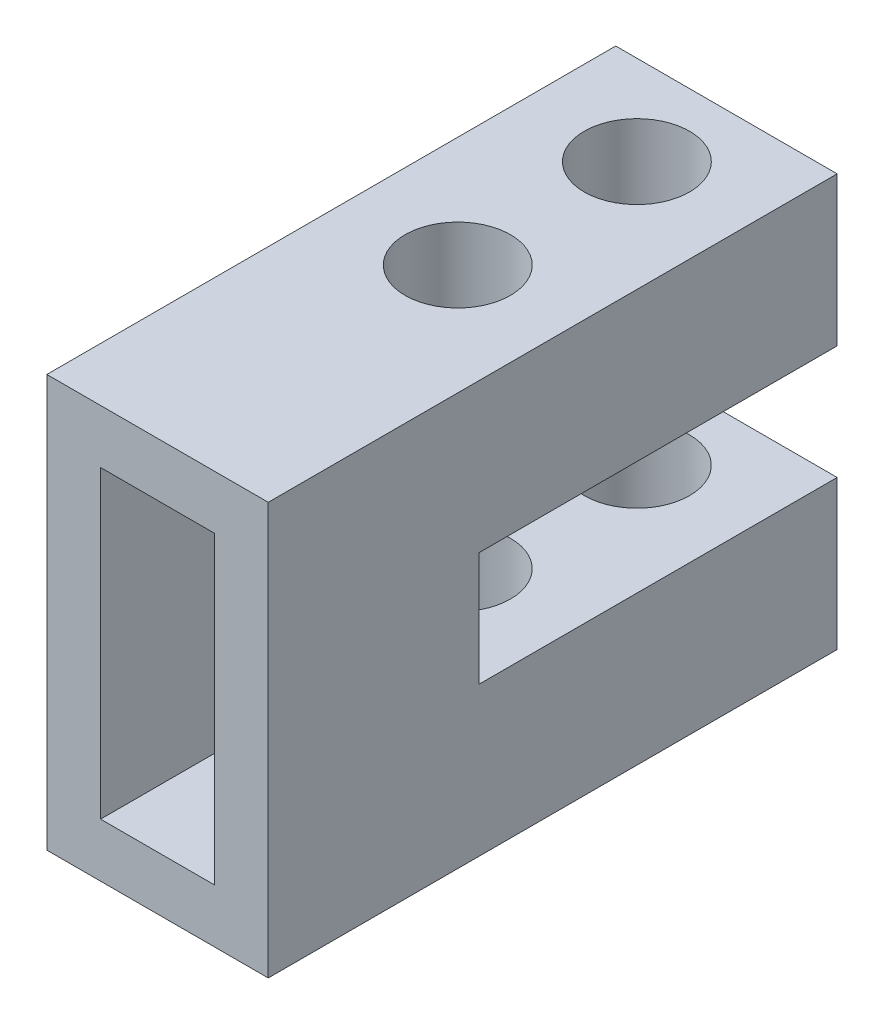
ISO-10303-21;
HEADER;
FILE_DESCRIPTION(('STEP AP214'),'2;1');
FILE_NAME('part.step','',(''),(''),'','','');
FILE_SCHEMA(('AUTOMOTIVE_DESIGN { 1 0 10303 214 1 1 1 1 }'));
ENDSEC;
DATA;
#1=APPLICATION_CONTEXT('core data for automotive mechanical design processes');
#2=APPLICATION_PROTOCOL_DEFINITION('international standard','automotive_design',2000,#1);
#3=PRODUCT_CONTEXT('',#1,'mechanical');
#4=PRODUCT('Part','Part','',(#3));
#5=PRODUCT_RELATED_PRODUCT_CATEGORY('part','',(#4));
#6=PRODUCT_DEFINITION_FORMATION('','',#4);
#7=PRODUCT_DEFINITION_CONTEXT('part definition',#1,'design');
#8=PRODUCT_DEFINITION('design','',#6,#7);
#9=PRODUCT_DEFINITION_SHAPE('','',#8);
#10=(LENGTH_UNIT() NAMED_UNIT(*) SI_UNIT(.MILLI.,.METRE.));
#11=(NAMED_UNIT(*) PLANE_ANGLE_UNIT() SI_UNIT($,.RADIAN.));
#12=(NAMED_UNIT(*) SI_UNIT($,.STERADIAN.) SOLID_ANGLE_UNIT());
#13=UNCERTAINTY_MEASURE_WITH_UNIT(LENGTH_MEASURE(1.E-05),#10,'distance_accuracy_value','');
#14=(GEOMETRIC_REPRESENTATION_CONTEXT(3) GLOBAL_UNCERTAINTY_ASSIGNED_CONTEXT((#13)) GLOBAL_UNIT_ASSIGNED_CONTEXT((#10,
#11,#12)) REPRESENTATION_CONTEXT('',''));
#15=CARTESIAN_POINT('',(0.,0.,0.));
#16=DIRECTION('',(0.,0.,1.));
#17=DIRECTION('',(1.,0.,0.));
#18=AXIS2_PLACEMENT_3D('',#15,#16,#17);
#19=CARTESIAN_POINT('',(0.,0.,-1.));
#20=DIRECTION('',(0.,0.,-1.));
#21=DIRECTION('',(-1.,0.,0.));
#22=AXIS2_PLACEMENT_3D('',#19,#20,#21);
#23=PLANE('',#22);
#24=DIRECTION('',(0.,-1.,0.));
#25=VECTOR('',#24,1.);
#26=CARTESIAN_POINT('',(4.68,10.,-1.));
#27=LINE('',#26,#25);
#28=CARTESIAN_POINT('',(4.68,5.84,-1.));
#29=VERTEX_POINT('',#28);
#30=CARTESIAN_POINT('',(4.68,2.66,-1.));
#31=VERTEX_POINT('',#30);
#32=EDGE_CURVE('E177',#29,#31,#27,.T.);
#33=ORIENTED_EDGE('',*,*,#32,.T.);
#34=DIRECTION('',(1.,0.,0.));
#35=VECTOR('',#34,1.);
#36=CARTESIAN_POINT('',(4.68,2.66,-1.));
#37=LINE('',#36,#35);
#38=CARTESIAN_POINT('',(-1.5,2.66,-1.));
#39=VERTEX_POINT('',#38);
#40=EDGE_CURVE('E147',#39,#31,#37,.T.);
#41=ORIENTED_EDGE('',*,*,#40,.F.);
#42=DIRECTION('',(0.,1.,0.));
#43=VECTOR('',#42,1.);
#44=CARTESIAN_POINT('',(-1.5,10.,-1.));
#45=LINE('',#44,#43);
#46=CARTESIAN_POINT('',(-1.5,5.84,-1.));
#47=VERTEX_POINT('',#46);
#48=EDGE_CURVE('E179',#39,#47,#45,.T.);
#49=ORIENTED_EDGE('',*,*,#48,.T.);
#50=DIRECTION('',(-1.,0.,0.));
#51=VECTOR('',#50,1.);
#52=CARTESIAN_POINT('',(4.68,5.84,-1.));
#53=LINE('',#52,#51);
#54=EDGE_CURVE('E58',#29,#47,#53,.T.);
#55=ORIENTED_EDGE('',*,*,#54,.F.);
#56=EDGE_LOOP('',(#33,#41,#49,#55));
#57=FACE_BOUND('',#56,.T.);
#58=ADVANCED_FACE('F33',(#57),#23,.T.);
#59=CARTESIAN_POINT('',(0.,0.,4.88));
#60=DIRECTION('',(0.,0.,1.));
#61=DIRECTION('',(1.,0.,0.));
#62=AXIS2_PLACEMENT_3D('',#59,#60,#61);
#63=PLANE('',#62);
#64=DIRECTION('',(0.,-1.,0.));
#65=VECTOR('',#64,1.);
#66=CARTESIAN_POINT('',(-1.5,10.,4.88));
#67=LINE('',#66,#65);
#68=CARTESIAN_POINT('',(-1.5,10.,4.88));
#69=VERTEX_POINT('',#68);
#70=CARTESIAN_POINT('',(-1.5,-1.5,4.88));
#71=VERTEX_POINT('',#70);
#72=EDGE_CURVE('E211',#69,#71,#67,.T.);
#73=ORIENTED_EDGE('',*,*,#72,.T.);
#74=DIRECTION('',(1.,0.,0.));
#75=VECTOR('',#74,1.);
#76=CARTESIAN_POINT('',(-1.5,-1.5,4.88));
#77=LINE('',#76,#75);
#78=CARTESIAN_POINT('',(4.68,-1.5,4.88));
#79=VERTEX_POINT('',#78);
#80=EDGE_CURVE('E214',#71,#79,#77,.T.);
#81=ORIENTED_EDGE('',*,*,#80,.T.);
#82=DIRECTION('',(0.,1.,0.));
#83=VECTOR('',#82,1.);
#84=CARTESIAN_POINT('',(4.68,10.,4.88));
#85=LINE('',#84,#83);
#86=CARTESIAN_POINT('',(4.68,10.,4.88));
#87=VERTEX_POINT('',#86);
#88=EDGE_CURVE('E132',#79,#87,#85,.T.);
#89=ORIENTED_EDGE('',*,*,#88,.T.);
#90=DIRECTION('',(-1.,0.,0.));
#91=VECTOR('',#90,1.);
#92=CARTESIAN_POINT('',(-1.5,10.,4.88));
#93=LINE('',#92,#91);
#94=EDGE_CURVE('E217',#87,#69,#93,.T.);
#95=ORIENTED_EDGE('',*,*,#94,.T.);
#96=EDGE_LOOP('',(#73,#81,#89,#95));
#97=FACE_BOUND('',#96,.T.);
#98=DIRECTION('',(1.,0.,0.));
#99=VECTOR('',#98,1.);
#100=CARTESIAN_POINT('',(0.,0.,4.88));
#101=LINE('',#100,#99);
#102=CARTESIAN_POINT('',(0.,0.,4.88));
#103=VERTEX_POINT('',#102);
#104=CARTESIAN_POINT('',(3.18,0.,4.88));
#105=VERTEX_POINT('',#104);
#106=EDGE_CURVE('E184',#103,#105,#101,.T.);
#107=ORIENTED_EDGE('',*,*,#106,.F.);
#108=DIRECTION('',(0.,-1.,0.));
#109=VECTOR('',#108,1.);
#110=CARTESIAN_POINT('',(0.,0.,4.88));
#111=LINE('',#110,#109);
#112=CARTESIAN_POINT('',(0.,8.5,4.88));
#113=VERTEX_POINT('',#112);
#114=EDGE_CURVE('E182',#113,#103,#111,.T.);
#115=ORIENTED_EDGE('',*,*,#114,.F.);
#116=DIRECTION('',(-1.,0.,0.));
#117=VECTOR('',#116,1.);
#118=CARTESIAN_POINT('',(0.,8.5,4.88));
#119=LINE('',#118,#117);
#120=CARTESIAN_POINT('',(3.18,8.5,4.88));
#121=VERTEX_POINT('',#120);
#122=EDGE_CURVE('E190',#121,#113,#119,.T.);
#123=ORIENTED_EDGE('',*,*,#122,.F.);
#124=DIRECTION('',(0.,1.,0.));
#125=VECTOR('',#124,1.);
#126=CARTESIAN_POINT('',(3.18,0.,4.88));
#127=LINE('',#126,#125);
#128=EDGE_CURVE('E187',#105,#121,#127,.T.);
#129=ORIENTED_EDGE('',*,*,#128,.F.);
#130=EDGE_LOOP('',(#107,#115,#123,#129));
#131=FACE_BOUND('',#130,.T.);
#132=ADVANCED_FACE('F267',(#97,#131),#63,.T.);
#133=CARTESIAN_POINT('',(-1.5,10.,4.88));
#134=DIRECTION('',(1.,0.,0.));
#135=DIRECTION('',(0.,1.,0.));
#136=AXIS2_PLACEMENT_3D('',#133,#134,#135);
#137=PLANE('',#136);
#138=DIRECTION('',(0.,0.,-1.));
#139=VECTOR('',#138,1.);
#140=CARTESIAN_POINT('',(-1.5,10.,4.88));
#141=LINE('',#140,#139);
#142=CARTESIAN_POINT('',(-1.5,10.,-11.));
#143=VERTEX_POINT('',#142);
#144=EDGE_CURVE('E219',#69,#143,#141,.T.);
#145=ORIENTED_EDGE('',*,*,#144,.T.);
#146=DIRECTION('',(0.,1.,0.));
#147=VECTOR('',#146,1.);
#148=CARTESIAN_POINT('',(-1.5,10.,-11.));
#149=LINE('',#148,#147);
#150=CARTESIAN_POINT('',(-1.5,5.84,-11.));
#151=VERTEX_POINT('',#150);
#152=EDGE_CURVE('E164',#151,#143,#149,.T.);
#153=ORIENTED_EDGE('',*,*,#152,.F.);
#154=DIRECTION('',(0.,0.,1.));
#155=VECTOR('',#154,1.);
#156=CARTESIAN_POINT('',(-1.5,5.84,-11.));
#157=LINE('',#156,#155);
#158=EDGE_CURVE('E170',#151,#47,#157,.T.);
#159=ORIENTED_EDGE('',*,*,#158,.T.);
#160=ORIENTED_EDGE('',*,*,#48,.F.);
#161=DIRECTION('',(0.,0.,1.));
#162=VECTOR('',#161,1.);
#163=CARTESIAN_POINT('',(-1.5,2.66,-11.));
#164=LINE('',#163,#162);
#165=CARTESIAN_POINT('',(-1.5,2.66,-11.));
#166=VERTEX_POINT('',#165);
#167=EDGE_CURVE('E50',#166,#39,#164,.T.);
#168=ORIENTED_EDGE('',*,*,#167,.F.);
#169=DIRECTION('',(0.,1.,0.));
#170=VECTOR('',#169,1.);
#171=CARTESIAN_POINT('',(-1.5,-1.5,-11.));
#172=LINE('',#171,#170);
#173=CARTESIAN_POINT('',(-1.5,-1.5,-11.));
#174=VERTEX_POINT('',#173);
#175=EDGE_CURVE('E142',#174,#166,#172,.T.);
#176=ORIENTED_EDGE('',*,*,#175,.F.);
#177=DIRECTION('',(0.,0.,-1.));
#178=VECTOR('',#177,1.);
#179=CARTESIAN_POINT('',(-1.5,-1.5,4.88));
#180=LINE('',#179,#178);
#181=EDGE_CURVE('E11',#71,#174,#180,.T.);
#182=ORIENTED_EDGE('',*,*,#181,.F.);
#183=ORIENTED_EDGE('',*,*,#72,.F.);
#184=EDGE_LOOP('',(#145,#153,#159,#160,#168,#176,#182,#183));
#185=FACE_BOUND('',#184,.T.);
#186=ADVANCED_FACE('F35',(#185),#137,.F.);
#187=CARTESIAN_POINT('',(-1.5,-1.5,4.88));
#188=DIRECTION('',(0.,1.,0.));
#189=DIRECTION('',(0.,0.,1.));
#190=AXIS2_PLACEMENT_3D('',#187,#188,#189);
#191=PLANE('',#190);
#192=CARTESIAN_POINT('',(1.59,-1.5,-3.50000000000008));
#193=DIRECTION('',(0.,1.,0.));
#194=DIRECTION('',(0.,0.,1.));
#195=AXIS2_PLACEMENT_3D('',#192,#193,#194);
#196=CIRCLE('',#195,1.47);
#197=CARTESIAN_POINT('',(1.59,-1.5,-2.03000000000008));
#198=VERTEX_POINT('',#197);
#199=EDGE_CURVE('E224',#198,#198,#196,.T.);
#200=ORIENTED_EDGE('',*,*,#199,.T.);
#201=EDGE_LOOP('',(#200));
#202=FACE_BOUND('',#201,.T.);
#203=CARTESIAN_POINT('',(1.59,-1.5,-8.5));
#204=DIRECTION('',(0.,1.,0.));
#205=DIRECTION('',(0.,0.,1.));
#206=AXIS2_PLACEMENT_3D('',#203,#204,#205);
#207=CIRCLE('',#206,1.47);
#208=CARTESIAN_POINT('',(1.59,-1.5,-7.03));
#209=VERTEX_POINT('',#208);
#210=EDGE_CURVE('E234',#209,#209,#207,.T.);
#211=ORIENTED_EDGE('',*,*,#210,.T.);
#212=EDGE_LOOP('',(#211));
#213=FACE_BOUND('',#212,.T.);
#214=ORIENTED_EDGE('',*,*,#181,.T.);
#215=DIRECTION('',(-1.,0.,0.));
#216=VECTOR('',#215,1.);
#217=CARTESIAN_POINT('',(4.68,-1.5,-11.));
#218=LINE('',#217,#216);
#219=CARTESIAN_POINT('',(4.68,-1.5,-11.));
#220=VERTEX_POINT('',#219);
#221=EDGE_CURVE('E137',#220,#174,#218,.T.);
#222=ORIENTED_EDGE('',*,*,#221,.F.);
#223=DIRECTION('',(0.,0.,-1.));
#224=VECTOR('',#223,1.);
#225=CARTESIAN_POINT('',(4.68,-1.5,4.88));
#226=LINE('',#225,#224);
#227=EDGE_CURVE('E42',#79,#220,#226,.T.);
#228=ORIENTED_EDGE('',*,*,#227,.F.);
#229=ORIENTED_EDGE('',*,*,#80,.F.);
#230=EDGE_LOOP('',(#214,#222,#228,#229));
#231=FACE_BOUND('',#230,.T.);
#232=ADVANCED_FACE('F138',(#202,#213,#231),#191,.F.);
#233=CARTESIAN_POINT('',(4.68,10.,4.88));
#234=DIRECTION('',(-1.,0.,0.));
#235=DIRECTION('',(0.,-1.,0.));
#236=AXIS2_PLACEMENT_3D('',#233,#234,#235);
#237=PLANE('',#236);
#238=ORIENTED_EDGE('',*,*,#227,.T.);
#239=DIRECTION('',(0.,-1.,0.));
#240=VECTOR('',#239,1.);
#241=CARTESIAN_POINT('',(4.68,-1.5,-11.));
#242=LINE('',#241,#240);
#243=CARTESIAN_POINT('',(4.68,2.66,-11.));
#244=VERTEX_POINT('',#243);
#245=EDGE_CURVE('E130',#244,#220,#242,.T.);
#246=ORIENTED_EDGE('',*,*,#245,.F.);
#247=DIRECTION('',(0.,0.,1.));
#248=VECTOR('',#247,1.);
#249=CARTESIAN_POINT('',(4.68,2.66,-11.));
#250=LINE('',#249,#248);
#251=EDGE_CURVE('E155',#244,#31,#250,.T.);
#252=ORIENTED_EDGE('',*,*,#251,.T.);
#253=ORIENTED_EDGE('',*,*,#32,.F.);
#254=DIRECTION('',(0.,0.,1.));
#255=VECTOR('',#254,1.);
#256=CARTESIAN_POINT('',(4.68,5.84,-11.));
#257=LINE('',#256,#255);
#258=CARTESIAN_POINT('',(4.68,5.84,-11.));
#259=VERTEX_POINT('',#258);
#260=EDGE_CURVE('E174',#259,#29,#257,.T.);
#261=ORIENTED_EDGE('',*,*,#260,.F.);
#262=DIRECTION('',(0.,-1.,0.));
#263=VECTOR('',#262,1.);
#264=CARTESIAN_POINT('',(4.68,10.,-11.));
#265=LINE('',#264,#263);
#266=CARTESIAN_POINT('',(4.68,10.,-11.));
#267=VERTEX_POINT('',#266);
#268=EDGE_CURVE('E159',#267,#259,#265,.T.);
#269=ORIENTED_EDGE('',*,*,#268,.F.);
#270=DIRECTION('',(0.,0.,-1.));
#271=VECTOR('',#270,1.);
#272=CARTESIAN_POINT('',(4.68,10.,4.88));
#273=LINE('',#272,#271);
#274=EDGE_CURVE('E134',#87,#267,#273,.T.);
#275=ORIENTED_EDGE('',*,*,#274,.F.);
#276=ORIENTED_EDGE('',*,*,#88,.F.);
#277=EDGE_LOOP('',(#238,#246,#252,#253,#261,#269,#275,#276));
#278=FACE_BOUND('',#277,.T.);
#279=ADVANCED_FACE('F127',(#278),#237,.F.);
#280=CARTESIAN_POINT('',(-1.5,10.,4.88));
#281=DIRECTION('',(0.,-1.,0.));
#282=DIRECTION('',(0.,0.,-1.));
#283=AXIS2_PLACEMENT_3D('',#280,#281,#282);
#284=PLANE('',#283);
#285=CARTESIAN_POINT('',(1.59,10.,-3.50000000000008));
#286=DIRECTION('',(0.,1.,0.));
#287=DIRECTION('',(0.,0.,1.));
#288=AXIS2_PLACEMENT_3D('',#285,#286,#287);
#289=CIRCLE('',#288,1.47);
#290=CARTESIAN_POINT('',(1.59,10.,-2.03000000000008));
#291=VERTEX_POINT('',#290);
#292=EDGE_CURVE('E229',#291,#291,#289,.T.);
#293=ORIENTED_EDGE('',*,*,#292,.F.);
#294=EDGE_LOOP('',(#293));
#295=FACE_BOUND('',#294,.T.);
#296=CARTESIAN_POINT('',(1.59,10.,-8.5));
#297=DIRECTION('',(0.,1.,0.));
#298=DIRECTION('',(0.,0.,1.));
#299=AXIS2_PLACEMENT_3D('',#296,#297,#298);
#300=CIRCLE('',#299,1.47);
#301=CARTESIAN_POINT('',(1.59,10.,-7.03));
#302=VERTEX_POINT('',#301);
#303=EDGE_CURVE('E239',#302,#302,#300,.T.);
#304=ORIENTED_EDGE('',*,*,#303,.F.);
#305=EDGE_LOOP('',(#304));
#306=FACE_BOUND('',#305,.T.);
#307=ORIENTED_EDGE('',*,*,#274,.T.);
#308=DIRECTION('',(1.,0.,0.));
#309=VECTOR('',#308,1.);
#310=CARTESIAN_POINT('',(4.68,10.,-11.));
#311=LINE('',#310,#309);
#312=EDGE_CURVE('E167',#143,#267,#311,.T.);
#313=ORIENTED_EDGE('',*,*,#312,.F.);
#314=ORIENTED_EDGE('',*,*,#144,.F.);
#315=ORIENTED_EDGE('',*,*,#94,.F.);
#316=EDGE_LOOP('',(#307,#313,#314,#315));
#317=FACE_BOUND('',#316,.T.);
#318=ADVANCED_FACE('F246',(#295,#306,#317),#284,.F.);
#319=CARTESIAN_POINT('',(0.,0.,4.88));
#320=DIRECTION('',(1.,0.,0.));
#321=DIRECTION('',(0.,0.,-1.));
#322=AXIS2_PLACEMENT_3D('',#319,#320,#321);
#323=PLANE('',#322);
#324=DIRECTION('',(0.,-1.,0.));
#325=VECTOR('',#324,1.);
#326=CARTESIAN_POINT('',(0.,0.,0.));
#327=LINE('',#326,#325);
#328=CARTESIAN_POINT('',(0.,8.5,0.));
#329=VERTEX_POINT('',#328);
#330=CARTESIAN_POINT('',(0.,0.,0.));
#331=VERTEX_POINT('',#330);
#332=EDGE_CURVE('E181',#329,#331,#327,.T.);
#333=ORIENTED_EDGE('',*,*,#332,.F.);
#334=DIRECTION('',(0.,0.,-1.));
#335=VECTOR('',#334,1.);
#336=CARTESIAN_POINT('',(0.,8.5,4.88));
#337=LINE('',#336,#335);
#338=EDGE_CURVE('E192',#113,#329,#337,.T.);
#339=ORIENTED_EDGE('',*,*,#338,.F.);
#340=ORIENTED_EDGE('',*,*,#114,.T.);
#341=DIRECTION('',(0.,0.,-1.));
#342=VECTOR('',#341,1.);
#343=CARTESIAN_POINT('',(0.,0.,4.88));
#344=LINE('',#343,#342);
#345=EDGE_CURVE('E208',#103,#331,#344,.T.);
#346=ORIENTED_EDGE('',*,*,#345,.T.);
#347=EDGE_LOOP('',(#333,#339,#340,#346));
#348=FACE_BOUND('',#347,.T.);
#349=ADVANCED_FACE('F249',(#348),#323,.T.);
#350=CARTESIAN_POINT('',(0.,0.,4.88));
#351=DIRECTION('',(0.,1.,0.));
#352=DIRECTION('',(0.,0.,1.));
#353=AXIS2_PLACEMENT_3D('',#350,#351,#352);
#354=PLANE('',#353);
#355=DIRECTION('',(1.,0.,0.));
#356=VECTOR('',#355,1.);
#357=CARTESIAN_POINT('',(0.,0.,0.));
#358=LINE('',#357,#356);
#359=CARTESIAN_POINT('',(3.18,0.,0.));
#360=VERTEX_POINT('',#359);
#361=EDGE_CURVE('E195',#331,#360,#358,.T.);
#362=ORIENTED_EDGE('',*,*,#361,.F.);
#363=ORIENTED_EDGE('',*,*,#345,.F.);
#364=ORIENTED_EDGE('',*,*,#106,.T.);
#365=DIRECTION('',(0.,0.,-1.));
#366=VECTOR('',#365,1.);
#367=CARTESIAN_POINT('',(3.18,0.,4.88));
#368=LINE('',#367,#366);
#369=EDGE_CURVE('E206',#105,#360,#368,.T.);
#370=ORIENTED_EDGE('',*,*,#369,.T.);
#371=EDGE_LOOP('',(#362,#363,#364,#370));
#372=FACE_BOUND('',#371,.T.);
#373=ADVANCED_FACE('F278',(#372),#354,.T.);
#374=CARTESIAN_POINT('',(3.18,0.,4.88));
#375=DIRECTION('',(-1.,0.,0.));
#376=DIRECTION('',(0.,0.,1.));
#377=AXIS2_PLACEMENT_3D('',#374,#375,#376);
#378=PLANE('',#377);
#379=DIRECTION('',(0.,1.,0.));
#380=VECTOR('',#379,1.);
#381=CARTESIAN_POINT('',(3.18,0.,0.));
#382=LINE('',#381,#380);
#383=CARTESIAN_POINT('',(3.18,8.5,0.));
#384=VERTEX_POINT('',#383);
#385=EDGE_CURVE('E198',#360,#384,#382,.T.);
#386=ORIENTED_EDGE('',*,*,#385,.F.);
#387=ORIENTED_EDGE('',*,*,#369,.F.);
#388=ORIENTED_EDGE('',*,*,#128,.T.);
#389=DIRECTION('',(0.,0.,-1.));
#390=VECTOR('',#389,1.);
#391=CARTESIAN_POINT('',(3.18,8.5,4.88));
#392=LINE('',#391,#390);
#393=EDGE_CURVE('E204',#121,#384,#392,.T.);
#394=ORIENTED_EDGE('',*,*,#393,.T.);
#395=EDGE_LOOP('',(#386,#387,#388,#394));
#396=FACE_BOUND('',#395,.T.);
#397=ADVANCED_FACE('F281',(#396),#378,.T.);
#398=CARTESIAN_POINT('',(0.,8.5,4.88));
#399=DIRECTION('',(0.,-1.,0.));
#400=DIRECTION('',(0.,0.,-1.));
#401=AXIS2_PLACEMENT_3D('',#398,#399,#400);
#402=PLANE('',#401);
#403=DIRECTION('',(-1.,0.,0.));
#404=VECTOR('',#403,1.);
#405=CARTESIAN_POINT('',(0.,8.5,0.));
#406=LINE('',#405,#404);
#407=EDGE_CURVE('E185',#384,#329,#406,.T.);
#408=ORIENTED_EDGE('',*,*,#407,.F.);
#409=ORIENTED_EDGE('',*,*,#393,.F.);
#410=ORIENTED_EDGE('',*,*,#122,.T.);
#411=ORIENTED_EDGE('',*,*,#338,.T.);
#412=EDGE_LOOP('',(#408,#409,#410,#411));
#413=FACE_BOUND('',#412,.T.);
#414=ADVANCED_FACE('F289',(#413),#402,.T.);
#415=CARTESIAN_POINT('',(0.,0.,0.));
#416=DIRECTION('',(0.,0.,-1.));
#417=DIRECTION('',(-1.,0.,0.));
#418=AXIS2_PLACEMENT_3D('',#415,#416,#417);
#419=PLANE('',#418);
#420=ORIENTED_EDGE('',*,*,#407,.T.);
#421=ORIENTED_EDGE('',*,*,#332,.T.);
#422=ORIENTED_EDGE('',*,*,#361,.T.);
#423=ORIENTED_EDGE('',*,*,#385,.T.);
#424=EDGE_LOOP('',(#420,#421,#422,#423));
#425=FACE_BOUND('',#424,.T.);
#426=ADVANCED_FACE('F284',(#425),#419,.F.);
#427=CARTESIAN_POINT('',(4.68,5.84,-11.));
#428=DIRECTION('',(0.,1.,0.));
#429=DIRECTION('',(0.,0.,1.));
#430=AXIS2_PLACEMENT_3D('',#427,#428,#429);
#431=PLANE('',#430);
#432=CARTESIAN_POINT('',(1.59,5.84,-3.50000000000008));
#433=DIRECTION('',(0.,1.,0.));
#434=DIRECTION('',(0.,0.,1.));
#435=AXIS2_PLACEMENT_3D('',#432,#433,#434);
#436=CIRCLE('',#435,1.47);
#437=CARTESIAN_POINT('',(1.59,5.84,-2.03000000000008));
#438=VERTEX_POINT('',#437);
#439=EDGE_CURVE('E149',#438,#438,#436,.T.);
#440=ORIENTED_EDGE('',*,*,#439,.T.);
#441=EDGE_LOOP('',(#440));
#442=FACE_BOUND('',#441,.T.);
#443=CARTESIAN_POINT('',(1.59,5.84,-8.5));
#444=DIRECTION('',(0.,1.,0.));
#445=DIRECTION('',(0.,0.,1.));
#446=AXIS2_PLACEMENT_3D('',#443,#444,#445);
#447=CIRCLE('',#446,1.47);
#448=CARTESIAN_POINT('',(1.59,5.84,-7.03));
#449=VERTEX_POINT('',#448);
#450=EDGE_CURVE('E223',#449,#449,#447,.T.);
#451=ORIENTED_EDGE('',*,*,#450,.T.);
#452=EDGE_LOOP('',(#451));
#453=FACE_BOUND('',#452,.T.);
#454=ORIENTED_EDGE('',*,*,#54,.T.);
#455=ORIENTED_EDGE('',*,*,#158,.F.);
#456=DIRECTION('',(-1.,0.,0.));
#457=VECTOR('',#456,1.);
#458=CARTESIAN_POINT('',(4.68,5.84,-11.));
#459=LINE('',#458,#457);
#460=EDGE_CURVE('E162',#259,#151,#459,.T.);
#461=ORIENTED_EDGE('',*,*,#460,.F.);
#462=ORIENTED_EDGE('',*,*,#260,.T.);
#463=EDGE_LOOP('',(#454,#455,#461,#462));
#464=FACE_BOUND('',#463,.T.);
#465=ADVANCED_FACE('F261',(#442,#453,#464),#431,.F.);
#466=CARTESIAN_POINT('',(0.,0.,-11.));
#467=DIRECTION('',(0.,0.,-1.));
#468=DIRECTION('',(-1.,0.,0.));
#469=AXIS2_PLACEMENT_3D('',#466,#467,#468);
#470=PLANE('',#469);
#471=ORIENTED_EDGE('',*,*,#268,.T.);
#472=ORIENTED_EDGE('',*,*,#460,.T.);
#473=ORIENTED_EDGE('',*,*,#152,.T.);
#474=ORIENTED_EDGE('',*,*,#312,.T.);
#475=EDGE_LOOP('',(#471,#472,#473,#474));
#476=FACE_BOUND('',#475,.T.);
#477=ADVANCED_FACE('F257',(#476),#470,.T.);
#478=CARTESIAN_POINT('',(4.68,2.66,-11.));
#479=DIRECTION('',(0.,-1.,0.));
#480=DIRECTION('',(0.,0.,-1.));
#481=AXIS2_PLACEMENT_3D('',#478,#479,#480);
#482=PLANE('',#481);
#483=CARTESIAN_POINT('',(1.59,2.66,-3.50000000000008));
#484=DIRECTION('',(0.,-1.,0.));
#485=DIRECTION('',(0.,0.,-1.));
#486=AXIS2_PLACEMENT_3D('',#483,#484,#485);
#487=CIRCLE('',#486,1.47);
#488=CARTESIAN_POINT('',(1.59,2.66,-4.97000000000009));
#489=VERTEX_POINT('',#488);
#490=EDGE_CURVE('E37',#489,#489,#487,.T.);
#491=ORIENTED_EDGE('',*,*,#490,.T.);
#492=EDGE_LOOP('',(#491));
#493=FACE_BOUND('',#492,.T.);
#494=CARTESIAN_POINT('',(1.59,2.66,-8.5));
#495=DIRECTION('',(0.,-1.,0.));
#496=DIRECTION('',(0.,0.,-1.));
#497=AXIS2_PLACEMENT_3D('',#494,#495,#496);
#498=CIRCLE('',#497,1.47);
#499=CARTESIAN_POINT('',(1.59,2.66,-9.97));
#500=VERTEX_POINT('',#499);
#501=EDGE_CURVE('E221',#500,#500,#498,.T.);
#502=ORIENTED_EDGE('',*,*,#501,.T.);
#503=EDGE_LOOP('',(#502));
#504=FACE_BOUND('',#503,.T.);
#505=ORIENTED_EDGE('',*,*,#40,.T.);
#506=ORIENTED_EDGE('',*,*,#251,.F.);
#507=DIRECTION('',(1.,0.,0.));
#508=VECTOR('',#507,1.);
#509=CARTESIAN_POINT('',(4.68,2.66,-11.));
#510=LINE('',#509,#508);
#511=EDGE_CURVE('E145',#166,#244,#510,.T.);
#512=ORIENTED_EDGE('',*,*,#511,.F.);
#513=ORIENTED_EDGE('',*,*,#167,.T.);
#514=EDGE_LOOP('',(#505,#506,#512,#513));
#515=FACE_BOUND('',#514,.T.);
#516=ADVANCED_FACE('F308',(#493,#504,#515),#482,.F.);
#517=CARTESIAN_POINT('',(0.,0.,-11.));
#518=DIRECTION('',(0.,0.,1.));
#519=DIRECTION('',(1.,0.,0.));
#520=AXIS2_PLACEMENT_3D('',#517,#518,#519);
#521=PLANE('',#520);
#522=ORIENTED_EDGE('',*,*,#245,.T.);
#523=ORIENTED_EDGE('',*,*,#221,.T.);
#524=ORIENTED_EDGE('',*,*,#175,.T.);
#525=ORIENTED_EDGE('',*,*,#511,.T.);
#526=EDGE_LOOP('',(#522,#523,#524,#525));
#527=FACE_BOUND('',#526,.T.);
#528=ADVANCED_FACE('F144',(#527),#521,.F.);
#529=CARTESIAN_POINT('',(1.59,-1.5,-8.5));
#530=DIRECTION('',(0.,1.,0.));
#531=DIRECTION('',(0.,0.,1.));
#532=AXIS2_PLACEMENT_3D('',#529,#530,#531);
#533=CYLINDRICAL_SURFACE('',#532,1.47);
#534=ORIENTED_EDGE('',*,*,#210,.F.);
#535=EDGE_LOOP('',(#534));
#536=FACE_BOUND('',#535,.T.);
#537=ORIENTED_EDGE('',*,*,#501,.F.);
#538=EDGE_LOOP('',(#537));
#539=FACE_BOUND('',#538,.T.);
#540=ADVANCED_FACE('F314',(#536,#539),#533,.F.);
#541=CARTESIAN_POINT('',(1.59,-1.5,-3.50000000000008));
#542=DIRECTION('',(0.,1.,0.));
#543=DIRECTION('',(0.,0.,1.));
#544=AXIS2_PLACEMENT_3D('',#541,#542,#543);
#545=CYLINDRICAL_SURFACE('',#544,1.47);
#546=ORIENTED_EDGE('',*,*,#199,.F.);
#547=EDGE_LOOP('',(#546));
#548=FACE_BOUND('',#547,.T.);
#549=ORIENTED_EDGE('',*,*,#490,.F.);
#550=EDGE_LOOP('',(#549));
#551=FACE_BOUND('',#550,.T.);
#552=ADVANCED_FACE('F318',(#548,#551),#545,.F.);
#553=ORIENTED_EDGE('',*,*,#303,.T.);
#554=EDGE_LOOP('',(#553));
#555=FACE_BOUND('',#554,.T.);
#556=ORIENTED_EDGE('',*,*,#450,.F.);
#557=EDGE_LOOP('',(#556));
#558=FACE_BOUND('',#557,.T.);
#559=ADVANCED_FACE('F243',(#555,#558),#533,.F.);
#560=ORIENTED_EDGE('',*,*,#292,.T.);
#561=EDGE_LOOP('',(#560));
#562=FACE_BOUND('',#561,.T.);
#563=ORIENTED_EDGE('',*,*,#439,.F.);
#564=EDGE_LOOP('',(#563));
#565=FACE_BOUND('',#564,.T.);
#566=ADVANCED_FACE('F317',(#562,#565),#545,.F.);
#567=CLOSED_SHELL('',(#58,#132,#186,#232,#279,#318,#349,#373,#397,#414,#426,#465,#477,#516,#528,
#540,#552,#559,#566));
#568=MANIFOLD_SOLID_BREP('B2',#567);
#569=ADVANCED_BREP_SHAPE_REPRESENTATION('',(#18,#568),#14);
#570=SHAPE_DEFINITION_REPRESENTATION(#9,#569);
ENDSEC;
END-ISO-10303-21;
